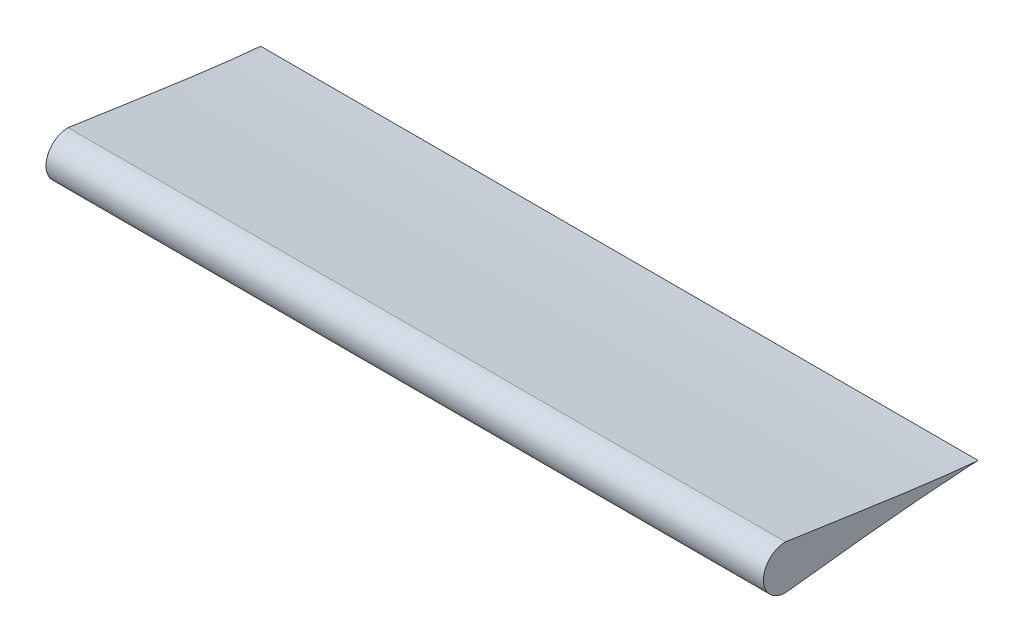
ISO-10303-21;
HEADER;
FILE_DESCRIPTION(('STEP AP214'),'2;1');
FILE_NAME('part.step','',(''),(''),'','','');
FILE_SCHEMA(('AUTOMOTIVE_DESIGN { 1 0 10303 214 1 1 1 1 }'));
ENDSEC;
DATA;
#1=APPLICATION_CONTEXT('core data for automotive mechanical design processes');
#2=APPLICATION_PROTOCOL_DEFINITION('international standard','automotive_design',2000,#1);
#3=PRODUCT_CONTEXT('',#1,'mechanical');
#4=PRODUCT('Part','Part','',(#3));
#5=PRODUCT_RELATED_PRODUCT_CATEGORY('part','',(#4));
#6=PRODUCT_DEFINITION_FORMATION('','',#4);
#7=PRODUCT_DEFINITION_CONTEXT('part definition',#1,'design');
#8=PRODUCT_DEFINITION('design','',#6,#7);
#9=PRODUCT_DEFINITION_SHAPE('','',#8);
#10=(LENGTH_UNIT() NAMED_UNIT(*) SI_UNIT(.MILLI.,.METRE.));
#11=(NAMED_UNIT(*) PLANE_ANGLE_UNIT() SI_UNIT($,.RADIAN.));
#12=(NAMED_UNIT(*) SI_UNIT($,.STERADIAN.) SOLID_ANGLE_UNIT());
#13=UNCERTAINTY_MEASURE_WITH_UNIT(LENGTH_MEASURE(1.E-05),#10,'distance_accuracy_value','');
#14=(GEOMETRIC_REPRESENTATION_CONTEXT(3) GLOBAL_UNCERTAINTY_ASSIGNED_CONTEXT((#13)) GLOBAL_UNIT_ASSIGNED_CONTEXT((#10,
#11,#12)) REPRESENTATION_CONTEXT('',''));
#15=CARTESIAN_POINT('',(0.,0.,0.));
#16=DIRECTION('',(0.,0.,1.));
#17=DIRECTION('',(1.,0.,0.));
#18=AXIS2_PLACEMENT_3D('',#15,#16,#17);
#19=CARTESIAN_POINT('',(932.,5.48492303991319,-346.600000000001));
#20=CARTESIAN_POINT('',(932.,5.49362778738663,-346.597852580919));
#21=CARTESIAN_POINT('',(932.,5.57828931731263,-345.167234249427));
#22=CARTESIAN_POINT('',(932.,5.75189803143239,-343.71043805504));
#23=CARTESIAN_POINT('',(932.,6.05499875930271,-340.208114490281));
#24=CARTESIAN_POINT('',(932.,6.49741873435106,-335.908168672115));
#25=CARTESIAN_POINT('',(932.,7.11688153715645,-330.293712937669));
#26=CARTESIAN_POINT('',(932.,7.8981787473702,-323.660621737616));
#27=CARTESIAN_POINT('',(932.,8.86731931719387,-316.003935667813));
#28=CARTESIAN_POINT('',(932.,10.0055667407348,-307.431375115838));
#29=CARTESIAN_POINT('',(932.,11.3072386025377,-298.020941908653));
#30=CARTESIAN_POINT('',(932.,12.7607482917284,-287.866437114615));
#31=CARTESIAN_POINT('',(932.,14.3419976397361,-277.062881510138));
#32=CARTESIAN_POINT('',(932.,16.0245413363357,-265.708532081932));
#33=CARTESIAN_POINT('',(932.,17.7643138135307,-253.900413677919));
#34=CARTESIAN_POINT('',(932.,19.5427898577671,-241.742132326499));
#35=CARTESIAN_POINT('',(932.,21.279803066596,-229.332900931877));
#36=CARTESIAN_POINT('',(932.,22.9571011888373,-216.768573809094));
#37=CARTESIAN_POINT('',(932.,24.400553091622,-204.080520549452));
#38=CARTESIAN_POINT('',(932.,25.5461139210719,-191.289754009893));
#39=CARTESIAN_POINT('',(932.,26.4978248972896,-178.433256045769));
#40=CARTESIAN_POINT('',(932.,27.2186317188383,-165.557442386287));
#41=CARTESIAN_POINT('',(932.,27.711658646537,-152.734886112874));
#42=CARTESIAN_POINT('',(932.,28.0019650167428,-140.032975070122));
#43=CARTESIAN_POINT('',(932.,28.0616736607792,-127.520246248135));
#44=CARTESIAN_POINT('',(932.,27.9189436259871,-115.2650849453));
#45=CARTESIAN_POINT('',(932.,27.5577560287743,-103.334541294071));
#46=CARTESIAN_POINT('',(932.,27.0006697552598,-91.7996972198163));
#47=CARTESIAN_POINT('',(932.,26.2431883229429,-80.724521293905));
#48=CARTESIAN_POINT('',(932.,25.3070472032228,-70.1756861232799));
#49=CARTESIAN_POINT('',(932.,24.182647353428,-60.2167424989174));
#50=CARTESIAN_POINT('',(932.,22.8897093843839,-50.9050900995766));
#51=CARTESIAN_POINT('',(932.,21.4097880208772,-42.2950141609851));
#52=CARTESIAN_POINT('',(932.,19.7808690039761,-34.4265564424189));
#53=CARTESIAN_POINT('',(932.,17.9593862375541,-27.334857027104));
#54=CARTESIAN_POINT('',(932.,15.9447316984175,-21.0457916868131));
#55=CARTESIAN_POINT('',(932.,13.8256713539493,-15.5468966677564));
#56=CARTESIAN_POINT('',(932.,11.5808470722572,-10.8692913452678));
#57=CARTESIAN_POINT('',(932.,9.27753496905476,-7.02450344338425));
#58=CARTESIAN_POINT('',(932.,6.94562984059433,-4.00722362393896));
#59=CARTESIAN_POINT('',(932.,4.54159528218445,-1.83797578921607));
#60=CARTESIAN_POINT('',(932.,2.20668365967197,-0.539555788466567));
#61=CARTESIAN_POINT('',(932.,0.0342194854246469,0.217479179130453));
#62=CARTESIAN_POINT('',(932.,-2.13253137856778,-0.442696975290507));
#63=CARTESIAN_POINT('',(932.,-3.57311990469622,-2.55393153359301));
#64=CARTESIAN_POINT('',(932.,-5.03014179894273,-5.40799775397902));
#65=CARTESIAN_POINT('',(932.,-6.42996468845119,-9.32218220696622));
#66=CARTESIAN_POINT('',(932.,-7.75053290484889,-14.175763480036));
#67=CARTESIAN_POINT('',(932.,-8.96721491676755,-19.9704140102435));
#68=CARTESIAN_POINT('',(932.,-10.0529189681702,-26.6659343012635));
#69=CARTESIAN_POINT('',(932.,-11.0054124337708,-34.2295339727684));
#70=CARTESIAN_POINT('',(932.,-11.8112238648561,-42.6237061592583));
#71=CARTESIAN_POINT('',(932.,-12.4666689793699,-51.8003765239409));
#72=CARTESIAN_POINT('',(932.,-12.9763735906072,-61.7097501584685));
#73=CARTESIAN_POINT('',(932.,-13.3328026263875,-72.2935771256876));
#74=CARTESIAN_POINT('',(932.,-13.5397901414656,-83.4916903814151));
#75=CARTESIAN_POINT('',(932.,-13.5960882230242,-95.2361217229905));
#76=CARTESIAN_POINT('',(932.,-13.5077074480462,-107.456450446033));
#77=CARTESIAN_POINT('',(932.,-13.2788618717373,-120.07773283464));
#78=CARTESIAN_POINT('',(932.,-12.9135498489524,-133.020320287703));
#79=CARTESIAN_POINT('',(932.,-12.4196305337505,-146.201346811317));
#80=CARTESIAN_POINT('',(932.,-11.7893297659568,-159.535041549597));
#81=CARTESIAN_POINT('',(932.,-11.0334284014507,-172.932558681055));
#82=CARTESIAN_POINT('',(932.,-10.1036923044349,-186.324187550782));
#83=CARTESIAN_POINT('',(932.,-8.97096812430148,-199.659680786966));
#84=CARTESIAN_POINT('',(932.,-7.68810078076981,-212.904448955982));
#85=CARTESIAN_POINT('',(932.,-6.29218718514479,-226.009272602402));
#86=CARTESIAN_POINT('',(932.,-4.82823959342188,-238.902789310325));
#87=CARTESIAN_POINT('',(932.,-3.36166925483122,-251.511271074392));
#88=CARTESIAN_POINT('',(932.,-1.93782108110024,-263.738942764924));
#89=CARTESIAN_POINT('',(932.,-0.613496306876071,-275.485379411777));
#90=CARTESIAN_POINT('',(932.,0.59193235798527,-286.639933501972));
#91=CARTESIAN_POINT('',(932.,1.65811298413648,-297.096452636855));
#92=CARTESIAN_POINT('',(932.,2.5719444593183,-306.755737406624));
#93=CARTESIAN_POINT('',(932.,3.33524864968809,-315.519648928747));
#94=CARTESIAN_POINT('',(932.,3.96188834155931,-323.3092405564));
#95=CARTESIAN_POINT('',(932.,4.45004267091875,-330.022501342235));
#96=CARTESIAN_POINT('',(932.,4.84379830074,-335.690543535704));
#97=CARTESIAN_POINT('',(932.,5.17604698278967,-340.042468385407));
#98=CARTESIAN_POINT('',(932.,5.38178688718854,-343.62404413471));
#99=CARTESIAN_POINT('',(932.,5.49426194639752,-345.115115042209));
#100=CARTESIAN_POINT('',(932.,5.47603395079092,-346.602192895276));
#101=CARTESIAN_POINT('',(932.,5.48492303991319,-346.600000000001));
#102=B_SPLINE_CURVE_WITH_KNOTS('',3,(#19,#20,#21,#22,#23,#24,#25,#26,#27,#28,#29,#30,#31,#32,
#33,#34,#35,#36,#37,#38,#39,#40,#41,#42,#43,#44,#45,#46,#47,#48,#49,#50,#51,#52,#53,#54,#55,#56,
#57,#58,#59,#60,#61,#62,#63,#64,#65,#66,#67,#68,#69,#70,#71,#72,#73,#74,#75,#76,#77,#78,#79,#80,
#81,#82,#83,#84,#85,#86,#87,#88,#89,#90,#91,#92,#93,#94,#95,#96,#97,#98,#99,#100,#101),
.UNSPECIFIED.,.T.,.F.,(4,1,1,1,1,1,1,1,1,1,1,1,1,1,1,1,1,1,1,1,1,1,1,1,1,1,1,1,1,1,1,1,1,1,1,1,
1,1,1,1,1,1,1,1,1,1,1,1,1,1,1,1,1,1,1,1,1,1,1,1,1,1,1,1,1,1,1,1,1,1,1,1,1,1,1,1,1,1,1,1,4),(0.,
0.000971237958935089,0.00379550488941406,0.00838889713311412,0.0147108585341679,
0.0226780451151255,0.0321935893654122,0.0431578374772158,0.0554477635765267,0.0689450810748732,
0.0835209743295518,0.0990345049396833,0.115338149300278,0.132292378261073,0.149748787287016,
0.167548160817062,0.185533000847794,0.203606824322396,0.221802152219981,0.240094780419079,
0.258381325545334,0.276593840485898,0.294615696320151,0.312363136598153,0.329758285552068,
0.34668867666744,0.363076304230722,0.378823915995178,0.393853850968574,0.408070676422894,
0.421404123740081,0.433792847882556,0.445184773052429,0.455537591190034,0.464887425285465,
0.473229998593558,0.480557633281548,0.486906623799577,0.492238034051424,0.496718364977629,
0.500526341599145,0.503606091199367,0.506177592628953,0.509478573363382,0.514052138731787,
0.519911011985978,0.527046393100711,0.535434514860353,0.545049400456516,0.555862282514593,
0.56781964692456,0.58087606000333,0.594950040868561,0.609977749598367,0.625870112949949,
0.642537246695213,0.659878939874303,0.677794441934522,0.696172799529494,0.714892973853184,
0.733838964579521,0.752890035469179,0.771908418749841,0.790874705845988,0.809754599599678,
0.828447710464764,0.846871330730811,0.864890849052298,0.882382263972322,0.89917761398861,
0.915117479075331,0.930053399369896,0.943838005379903,0.956340240690094,0.967439356026097,
0.977019226998307,0.985009700423928,0.991382470548144,0.996091139759218,0.999008193999625,1.),.UNSPECIFIED.);
#103=DIRECTION('',(-1.,0.,0.));
#104=VECTOR('',#103,1.);
#105=SURFACE_OF_LINEAR_EXTRUSION('',#102,#104);
#106=CARTESIAN_POINT('',(-470.4,-4.08102886649603,-245.320255568965));
#107=CARTESIAN_POINT('',(-470.4,-3.83688472720822,-247.42513010929));
#108=CARTESIAN_POINT('',(-470.4,-3.1162425428744,-253.618937687491));
#109=CARTESIAN_POINT('',(-470.4,-1.93782108110019,-263.738942764924));
#110=CARTESIAN_POINT('',(-470.4,-0.613496306876071,-275.485379411778));
#111=CARTESIAN_POINT('',(-470.4,0.59193235798527,-286.639933501972));
#112=CARTESIAN_POINT('',(-470.4,1.65811298413665,-297.096452636855));
#113=CARTESIAN_POINT('',(-470.4,2.57194445931841,-306.755737406624));
#114=CARTESIAN_POINT('',(-470.4,3.33524864968815,-315.519648928747));
#115=CARTESIAN_POINT('',(-470.4,3.96188834155936,-323.309240556401));
#116=CARTESIAN_POINT('',(-470.4,4.45004267091875,-330.022501342234));
#117=CARTESIAN_POINT('',(-470.4,4.84379830074011,-335.690543535704));
#118=CARTESIAN_POINT('',(-470.4,5.17604698278984,-340.042468385407));
#119=CARTESIAN_POINT('',(-470.4,5.38178688718871,-343.62404413471));
#120=CARTESIAN_POINT('',(-470.4,5.49426194639768,-345.11511504221));
#121=CARTESIAN_POINT('',(-470.4,5.47150482461145,-346.971688443804));
#122=CARTESIAN_POINT('',(-470.4,5.57828931731269,-345.167234249427));
#123=CARTESIAN_POINT('',(-470.4,5.75189803143256,-343.71043805504));
#124=CARTESIAN_POINT('',(-470.4,6.05499875930271,-340.208114490281));
#125=CARTESIAN_POINT('',(-470.4,6.49741873435111,-335.908168672115));
#126=CARTESIAN_POINT('',(-470.4,7.11688153715645,-330.29371293767));
#127=CARTESIAN_POINT('',(-470.4,7.89817874737037,-323.660621737616));
#128=CARTESIAN_POINT('',(-470.4,8.86731931719403,-316.003935667813));
#129=CARTESIAN_POINT('',(-470.4,10.0055667407348,-307.431375115838));
#130=CARTESIAN_POINT('',(-470.4,11.3072386025378,-298.020941908653));
#131=CARTESIAN_POINT('',(-470.4,12.7607482917285,-287.866437114615));
#132=CARTESIAN_POINT('',(-470.4,14.3419976397363,-277.062881510138));
#133=CARTESIAN_POINT('',(-470.4,16.0245413363361,-265.708532081931));
#134=CARTESIAN_POINT('',(-470.4,17.5608683799686,-255.281230882322));
#135=CARTESIAN_POINT('',(-470.4,18.5322005175769,-248.649148291305));
#136=CARTESIAN_POINT('',(-470.4,18.9214051721273,-245.964575178277));
#137=B_SPLINE_CURVE_WITH_KNOTS('',3,(#106,#107,#108,#109,#110,#111,#112,#113,#114,#115,#116,
#117,#118,#119,#120,#121,#122,#123,#124,#125,#126,#127,#128,#129,#130,#131,#132,#133,#134,#135,
#136),.UNSPECIFIED.,.F.,.F.,(4,1,1,1,1,1,1,1,1,1,1,1,1,1,1,1,1,1,1,1,1,1,1,1,1,1,1,1,4),(0.,
0.0312698369740128,0.092018455833629,0.150349604080833,0.205709607445592,0.257582856890572,
0.305457530292392,0.348878461716447,0.387426282479295,0.420697686369491,0.448449027633784,
0.470581998872876,0.486935458701452,0.497066543982633,0.500511139229783,0.503884300569738,
0.51369313056445,0.529646227324267,0.551602737152306,0.579273201960499,0.61232119570746,
0.650400615392583,0.693084185580216,0.73996109062668,0.79058394692021,0.844463267861992,
0.901086696087382,0.959969639400267,1.),.UNSPECIFIED.);
#138=CARTESIAN_POINT('',(-470.4,-4.08102886649603,-245.320255568965));
#139=VERTEX_POINT('',#138);
#140=CARTESIAN_POINT('',(-470.4,18.9214051721273,-245.964575178277));
#141=VERTEX_POINT('',#140);
#142=EDGE_CURVE('E91',#139,#141,#137,.T.);
#143=ORIENTED_EDGE('',*,*,#142,.T.);
#144=CARTESIAN_POINT('',(-470.4,5.48492303991321,-346.600000000001));
#145=CARTESIAN_POINT('',(-470.4,5.49362778738664,-346.597852580919));
#146=CARTESIAN_POINT('',(-470.4,5.57828931731269,-345.167234249427));
#147=CARTESIAN_POINT('',(-470.4,5.75189803143256,-343.71043805504));
#148=CARTESIAN_POINT('',(-470.4,6.05499875930271,-340.208114490281));
#149=CARTESIAN_POINT('',(-470.4,6.49741873435111,-335.908168672115));
#150=CARTESIAN_POINT('',(-470.4,7.11688153715645,-330.29371293767));
#151=CARTESIAN_POINT('',(-470.4,7.89817874737037,-323.660621737616));
#152=CARTESIAN_POINT('',(-470.4,8.86731931719403,-316.003935667813));
#153=CARTESIAN_POINT('',(-470.4,10.0055667407348,-307.431375115838));
#154=CARTESIAN_POINT('',(-470.4,11.3072386025378,-298.020941908653));
#155=CARTESIAN_POINT('',(-470.4,12.7607482917285,-287.866437114615));
#156=CARTESIAN_POINT('',(-470.4,14.3419976397363,-277.062881510138));
#157=CARTESIAN_POINT('',(-470.4,16.0245413363361,-265.708532081931));
#158=CARTESIAN_POINT('',(-470.4,17.7643138135308,-253.900413677919));
#159=CARTESIAN_POINT('',(-470.4,19.5427898577673,-241.742132326499));
#160=CARTESIAN_POINT('',(-470.4,21.279803066596,-229.332900931877));
#161=CARTESIAN_POINT('',(-470.4,22.9571011888375,-216.768573809094));
#162=CARTESIAN_POINT('',(-470.4,24.4005530916221,-204.080520549452));
#163=CARTESIAN_POINT('',(-470.4,25.546113921072,-191.289754009893));
#164=CARTESIAN_POINT('',(-470.4,26.4978248972897,-178.433256045769));
#165=CARTESIAN_POINT('',(-470.4,27.2186317188383,-165.557442386287));
#166=CARTESIAN_POINT('',(-470.4,27.711658646537,-152.734886112874));
#167=CARTESIAN_POINT('',(-470.4,28.0019650167428,-140.032975070122));
#168=CARTESIAN_POINT('',(-470.4,28.0616736607793,-127.520246248135));
#169=CARTESIAN_POINT('',(-470.4,27.9189436259871,-115.2650849453));
#170=CARTESIAN_POINT('',(-470.4,27.5577560287744,-103.334541294071));
#171=CARTESIAN_POINT('',(-470.4,27.0006697552599,-91.7996972198164));
#172=CARTESIAN_POINT('',(-470.4,26.243188322943,-80.7245212939049));
#173=CARTESIAN_POINT('',(-470.4,25.3070472032229,-70.1756861232799));
#174=CARTESIAN_POINT('',(-470.4,24.1826473534281,-60.2167424989174));
#175=CARTESIAN_POINT('',(-470.4,22.8897093843841,-50.9050900995766));
#176=CARTESIAN_POINT('',(-470.4,21.4097880208774,-42.2950141609851));
#177=CARTESIAN_POINT('',(-470.4,19.7808690039764,-34.4265564424188));
#178=CARTESIAN_POINT('',(-470.4,17.9593862375542,-27.3348570271041));
#179=CARTESIAN_POINT('',(-470.4,15.9447316984176,-21.0457916868131));
#180=CARTESIAN_POINT('',(-470.4,13.8256713539494,-15.5468966677564));
#181=CARTESIAN_POINT('',(-470.4,11.5808470722573,-10.8692913452678));
#182=CARTESIAN_POINT('',(-470.4,9.27753496905492,-7.02450344338433));
#183=CARTESIAN_POINT('',(-470.4,6.94562984059433,-4.00722362393885));
#184=CARTESIAN_POINT('',(-470.4,4.54159528218445,-1.83797578921607));
#185=CARTESIAN_POINT('',(-470.4,2.20668365967208,-0.539555788466567));
#186=CARTESIAN_POINT('',(-470.4,0.0342194854247579,0.217479179130453));
#187=CARTESIAN_POINT('',(-470.4,-2.13253137856767,-0.44269697529048));
#188=CARTESIAN_POINT('',(-470.4,-3.57311990469611,-2.55393153359304));
#189=CARTESIAN_POINT('',(-470.4,-5.03014179894257,-5.40799775397899));
#190=CARTESIAN_POINT('',(-470.4,-6.42996468845119,-9.32218220696619));
#191=CARTESIAN_POINT('',(-470.4,-7.75053290484895,-14.175763480036));
#192=CARTESIAN_POINT('',(-470.4,-8.9672149167675,-19.9704140102435));
#193=CARTESIAN_POINT('',(-470.4,-10.05291896817,-26.6659343012634));
#194=CARTESIAN_POINT('',(-470.4,-11.0054124337708,-34.2295339727684));
#195=CARTESIAN_POINT('',(-470.4,-11.8112238648559,-42.6237061592583));
#196=CARTESIAN_POINT('',(-470.4,-12.4666689793698,-51.8003765239409));
#197=CARTESIAN_POINT('',(-470.4,-12.9763735906071,-61.7097501584686));
#198=CARTESIAN_POINT('',(-470.4,-13.3328026263874,-72.2935771256876));
#199=CARTESIAN_POINT('',(-470.4,-13.5397901414656,-83.4916903814152));
#200=CARTESIAN_POINT('',(-470.4,-13.5960882230241,-95.2361217229904));
#201=CARTESIAN_POINT('',(-470.4,-13.5077074480461,-107.456450446033));
#202=CARTESIAN_POINT('',(-470.4,-13.2788618717373,-120.07773283464));
#203=CARTESIAN_POINT('',(-470.4,-12.9135498489523,-133.020320287703));
#204=CARTESIAN_POINT('',(-470.4,-12.4196305337504,-146.201346811317));
#205=CARTESIAN_POINT('',(-470.4,-11.7893297659567,-159.535041549597));
#206=CARTESIAN_POINT('',(-470.4,-11.0334284014506,-172.932558681055));
#207=CARTESIAN_POINT('',(-470.4,-10.1036923044348,-186.324187550782));
#208=CARTESIAN_POINT('',(-470.4,-8.97096812430132,-199.659680786966));
#209=CARTESIAN_POINT('',(-470.4,-7.68810078076976,-212.904448955982));
#210=CARTESIAN_POINT('',(-470.4,-6.29218718514479,-226.009272602402));
#211=CARTESIAN_POINT('',(-470.4,-4.82823959342177,-238.902789310325));
#212=CARTESIAN_POINT('',(-470.4,-3.36166925483111,-251.511271074392));
#213=CARTESIAN_POINT('',(-470.4,-1.93782108110019,-263.738942764924));
#214=CARTESIAN_POINT('',(-470.4,-0.613496306876071,-275.485379411778));
#215=CARTESIAN_POINT('',(-470.4,0.59193235798527,-286.639933501972));
#216=CARTESIAN_POINT('',(-470.4,1.65811298413665,-297.096452636855));
#217=CARTESIAN_POINT('',(-470.4,2.57194445931841,-306.755737406624));
#218=CARTESIAN_POINT('',(-470.4,3.33524864968815,-315.519648928747));
#219=CARTESIAN_POINT('',(-470.4,3.96188834155936,-323.309240556401));
#220=CARTESIAN_POINT('',(-470.4,4.45004267091875,-330.022501342234));
#221=CARTESIAN_POINT('',(-470.4,4.84379830074011,-335.690543535704));
#222=CARTESIAN_POINT('',(-470.4,5.17604698278984,-340.042468385407));
#223=CARTESIAN_POINT('',(-470.4,5.38178688718871,-343.62404413471));
#224=CARTESIAN_POINT('',(-470.4,5.49426194639768,-345.11511504221));
#225=CARTESIAN_POINT('',(-470.4,5.47603395079096,-346.602192895276));
#226=CARTESIAN_POINT('',(-470.4,5.48492303991321,-346.600000000001));
#227=B_SPLINE_CURVE_WITH_KNOTS('',3,(#144,#145,#146,#147,#148,#149,#150,#151,#152,#153,#154,
#155,#156,#157,#158,#159,#160,#161,#162,#163,#164,#165,#166,#167,#168,#169,#170,#171,#172,#173,
#174,#175,#176,#177,#178,#179,#180,#181,#182,#183,#184,#185,#186,#187,#188,#189,#190,#191,#192,
#193,#194,#195,#196,#197,#198,#199,#200,#201,#202,#203,#204,#205,#206,#207,#208,#209,#210,#211,
#212,#213,#214,#215,#216,#217,#218,#219,#220,#221,#222,#223,#224,#225,#226),.UNSPECIFIED.,.T.,
.F.,(4,1,1,1,1,1,1,1,1,1,1,1,1,1,1,1,1,1,1,1,1,1,1,1,1,1,1,1,1,1,1,1,1,1,1,1,1,1,1,1,1,1,1,1,1,
1,1,1,1,1,1,1,1,1,1,1,1,1,1,1,1,1,1,1,1,1,1,1,1,1,1,1,1,1,1,1,1,1,1,1,4),(0.,
0.000971237958935089,0.00379550488941406,0.00838889713311412,0.0147108585341679,
0.0226780451151255,0.0321935893654122,0.0431578374772158,0.0554477635765267,0.0689450810748732,
0.0835209743295518,0.0990345049396833,0.115338149300278,0.132292378261073,0.149748787287016,
0.167548160817062,0.185533000847794,0.203606824322396,0.221802152219981,0.240094780419079,
0.258381325545334,0.276593840485898,0.294615696320151,0.312363136598153,0.329758285552068,
0.34668867666744,0.363076304230722,0.378823915995178,0.393853850968574,0.408070676422894,
0.421404123740081,0.433792847882556,0.445184773052429,0.455537591190034,0.464887425285465,
0.473229998593558,0.480557633281548,0.486906623799577,0.492238034051424,0.496718364977629,
0.500526341599145,0.503606091199367,0.506177592628953,0.509478573363382,0.514052138731787,
0.519911011985978,0.527046393100711,0.535434514860353,0.545049400456516,0.555862282514593,
0.56781964692456,0.58087606000333,0.594950040868561,0.609977749598367,0.625870112949949,
0.642537246695213,0.659878939874303,0.677794441934522,0.696172799529494,0.714892973853184,
0.733838964579521,0.752890035469179,0.771908418749841,0.790874705845988,0.809754599599678,
0.828447710464764,0.846871330730811,0.864890849052298,0.882382263972322,0.89917761398861,
0.915117479075331,0.930053399369896,0.943838005379903,0.956340240690094,0.967439356026097,
0.977019226998307,0.985009700423928,0.991382470548144,0.996091139759218,0.999008193999625,1.),.UNSPECIFIED.);
#228=CARTESIAN_POINT('',(-470.4,19.4068935617341,-242.600000000001));
#229=VERTEX_POINT('',#228);
#230=EDGE_CURVE('E63',#229,#141,#227,.F.);
#231=ORIENTED_EDGE('',*,*,#230,.F.);
#232=DIRECTION('',(-1.,0.,0.));
#233=VECTOR('',#232,1.);
#234=CARTESIAN_POINT('',(-507.499999999995,19.4068935617341,-242.600000000001));
#235=LINE('',#234,#233);
#236=CARTESIAN_POINT('',(-83.,19.4068935617339,-242.600000000001));
#237=VERTEX_POINT('',#236);
#238=EDGE_CURVE('E75',#229,#237,#235,.F.);
#239=ORIENTED_EDGE('',*,*,#238,.T.);
#240=CARTESIAN_POINT('',(-83.0000000000001,5.48492303991319,-346.600000000001));
#241=CARTESIAN_POINT('',(-83.0000000000001,5.49362778738663,-346.597852580919));
#242=CARTESIAN_POINT('',(-83.0000000000001,5.57828931731263,-345.167234249427));
#243=CARTESIAN_POINT('',(-83.0000000000001,5.75189803143261,-343.71043805504));
#244=CARTESIAN_POINT('',(-83.0000000000001,6.05499875930277,-340.208114490281));
#245=CARTESIAN_POINT('',(-83.0000000000001,6.49741873435111,-335.908168672115));
#246=CARTESIAN_POINT('',(-83.0000000000001,7.11688153715651,-330.293712937669));
#247=CARTESIAN_POINT('',(-83.0000000000001,7.89817874737037,-323.660621737616));
#248=CARTESIAN_POINT('',(-83.0000000000001,8.86731931719392,-316.003935667813));
#249=CARTESIAN_POINT('',(-83.0000000000001,10.0055667407348,-307.431375115838));
#250=CARTESIAN_POINT('',(-83.0000000000001,11.3072386025378,-298.020941908653));
#251=CARTESIAN_POINT('',(-83.0000000000001,12.7607482917285,-287.866437114615));
#252=CARTESIAN_POINT('',(-83.0000000000001,14.3419976397362,-277.062881510138));
#253=CARTESIAN_POINT('',(-83.0000000000001,16.0245413363359,-265.708532081932));
#254=CARTESIAN_POINT('',(-83.,17.7643138135307,-253.900413677919));
#255=CARTESIAN_POINT('',(-83.,19.5427898577673,-241.742132326499));
#256=CARTESIAN_POINT('',(-83.,21.279803066596,-229.332900931877));
#257=CARTESIAN_POINT('',(-83.,22.9571011888375,-216.768573809094));
#258=CARTESIAN_POINT('',(-83.,24.4005530916221,-204.080520549452));
#259=CARTESIAN_POINT('',(-83.,25.546113921072,-191.289754009893));
#260=CARTESIAN_POINT('',(-83.,26.4978248972896,-178.433256045769));
#261=CARTESIAN_POINT('',(-83.,27.2186317188383,-165.557442386287));
#262=CARTESIAN_POINT('',(-83.,27.711658646537,-152.734886112874));
#263=CARTESIAN_POINT('',(-83.,28.0019650167428,-140.032975070122));
#264=CARTESIAN_POINT('',(-83.,28.0616736607793,-127.520246248135));
#265=CARTESIAN_POINT('',(-83.0000000000001,27.9189436259871,-115.2650849453));
#266=CARTESIAN_POINT('',(-83.0000000000001,27.5577560287743,-103.334541294071));
#267=CARTESIAN_POINT('',(-83.0000000000001,27.0006697552599,-91.7996972198163));
#268=CARTESIAN_POINT('',(-83.0000000000001,26.243188322943,-80.724521293905));
#269=CARTESIAN_POINT('',(-83.0000000000001,25.3070472032229,-70.1756861232799));
#270=CARTESIAN_POINT('',(-83.0000000000001,24.1826473534281,-60.2167424989174));
#271=CARTESIAN_POINT('',(-83.0000000000001,22.8897093843841,-50.9050900995766));
#272=CARTESIAN_POINT('',(-83.0000000000001,21.4097880208774,-42.2950141609851));
#273=CARTESIAN_POINT('',(-83.0000000000001,19.7808690039764,-34.4265564424188));
#274=CARTESIAN_POINT('',(-83.0000000000001,17.9593862375542,-27.334857027104));
#275=CARTESIAN_POINT('',(-83.0000000000001,15.9447316984175,-21.0457916868131));
#276=CARTESIAN_POINT('',(-83.0000000000001,13.8256713539494,-15.5468966677564));
#277=CARTESIAN_POINT('',(-83.0000000000001,11.5808470722573,-10.8692913452678));
#278=CARTESIAN_POINT('',(-83.0000000000001,9.27753496905492,-7.02450344338425));
#279=CARTESIAN_POINT('',(-83.,6.94562984059433,-4.00722362393896));
#280=CARTESIAN_POINT('',(-83.,4.54159528218451,-1.83797578921607));
#281=CARTESIAN_POINT('',(-83.,2.20668365967214,-0.539555788466567));
#282=CARTESIAN_POINT('',(-83.,0.0342194854248135,0.217479179130453));
#283=CARTESIAN_POINT('',(-83.,-2.13253137856767,-0.442696975290507));
#284=CARTESIAN_POINT('',(-83.,-3.57311990469616,-2.55393153359301));
#285=CARTESIAN_POINT('',(-83.0000000000001,-5.03014179894268,-5.40799775397902));
#286=CARTESIAN_POINT('',(-83.0000000000001,-6.42996468845114,-9.32218220696619));
#287=CARTESIAN_POINT('',(-83.0000000000001,-7.75053290484895,-14.175763480036));
#288=CARTESIAN_POINT('',(-83.0000000000001,-8.9672149167675,-19.9704140102435));
#289=CARTESIAN_POINT('',(-83.0000000000001,-10.05291896817,-26.6659343012635));
#290=CARTESIAN_POINT('',(-83.0000000000001,-11.0054124337708,-34.2295339727684));
#291=CARTESIAN_POINT('',(-83.0000000000001,-11.8112238648559,-42.6237061592583));
#292=CARTESIAN_POINT('',(-83.0000000000001,-12.4666689793699,-51.8003765239409));
#293=CARTESIAN_POINT('',(-83.0000000000001,-12.9763735906071,-61.7097501584686));
#294=CARTESIAN_POINT('',(-83.0000000000001,-13.3328026263874,-72.2935771256876));
#295=CARTESIAN_POINT('',(-83.0000000000001,-13.5397901414656,-83.4916903814151));
#296=CARTESIAN_POINT('',(-83.0000000000001,-13.5960882230241,-95.2361217229905));
#297=CARTESIAN_POINT('',(-83.0000000000001,-13.5077074480461,-107.456450446033));
#298=CARTESIAN_POINT('',(-83.0000000000001,-13.2788618717372,-120.07773283464));
#299=CARTESIAN_POINT('',(-83.,-12.9135498489523,-133.020320287703));
#300=CARTESIAN_POINT('',(-83.,-12.4196305337504,-146.201346811317));
#301=CARTESIAN_POINT('',(-83.,-11.7893297659568,-159.535041549597));
#302=CARTESIAN_POINT('',(-83.,-11.0334284014506,-172.932558681055));
#303=CARTESIAN_POINT('',(-83.,-10.1036923044348,-186.324187550782));
#304=CARTESIAN_POINT('',(-83.,-8.97096812430132,-199.659680786966));
#305=CARTESIAN_POINT('',(-83.,-7.6881007807697,-212.904448955982));
#306=CARTESIAN_POINT('',(-83.,-6.29218718514474,-226.009272602402));
#307=CARTESIAN_POINT('',(-83.,-4.82823959342182,-238.902789310325));
#308=CARTESIAN_POINT('',(-83.,-3.36166925483117,-251.511271074392));
#309=CARTESIAN_POINT('',(-83.0000000000001,-1.93782108110019,-263.738942764924));
#310=CARTESIAN_POINT('',(-83.0000000000001,-0.61349630687596,-275.485379411777));
#311=CARTESIAN_POINT('',(-83.0000000000001,0.591932357985325,-286.639933501972));
#312=CARTESIAN_POINT('',(-83.0000000000001,1.65811298413671,-297.096452636855));
#313=CARTESIAN_POINT('',(-83.0000000000001,2.57194445931846,-306.755737406624));
#314=CARTESIAN_POINT('',(-83.0000000000001,3.33524864968821,-315.519648928747));
#315=CARTESIAN_POINT('',(-83.0000000000001,3.96188834155936,-323.3092405564));
#316=CARTESIAN_POINT('',(-83.0000000000001,4.45004267091881,-330.022501342235));
#317=CARTESIAN_POINT('',(-83.0000000000001,4.84379830074016,-335.690543535704));
#318=CARTESIAN_POINT('',(-83.0000000000001,5.17604698278984,-340.042468385407));
#319=CARTESIAN_POINT('',(-83.0000000000001,5.3817868871886,-343.62404413471));
#320=CARTESIAN_POINT('',(-83.0000000000001,5.49426194639752,-345.115115042209));
#321=CARTESIAN_POINT('',(-83.0000000000001,5.47603395079092,-346.602192895276));
#322=CARTESIAN_POINT('',(-83.0000000000001,5.48492303991319,-346.600000000001));
#323=B_SPLINE_CURVE_WITH_KNOTS('',3,(#240,#241,#242,#243,#244,#245,#246,#247,#248,#249,#250,
#251,#252,#253,#254,#255,#256,#257,#258,#259,#260,#261,#262,#263,#264,#265,#266,#267,#268,#269,
#270,#271,#272,#273,#274,#275,#276,#277,#278,#279,#280,#281,#282,#283,#284,#285,#286,#287,#288,
#289,#290,#291,#292,#293,#294,#295,#296,#297,#298,#299,#300,#301,#302,#303,#304,#305,#306,#307,
#308,#309,#310,#311,#312,#313,#314,#315,#316,#317,#318,#319,#320,#321,#322),.UNSPECIFIED.,.T.,
.F.,(4,1,1,1,1,1,1,1,1,1,1,1,1,1,1,1,1,1,1,1,1,1,1,1,1,1,1,1,1,1,1,1,1,1,1,1,1,1,1,1,1,1,1,1,1,
1,1,1,1,1,1,1,1,1,1,1,1,1,1,1,1,1,1,1,1,1,1,1,1,1,1,1,1,1,1,1,1,1,1,1,4),(0.,
0.000971237958935089,0.00379550488941406,0.00838889713311412,0.0147108585341679,
0.0226780451151255,0.0321935893654122,0.0431578374772158,0.0554477635765267,0.0689450810748732,
0.0835209743295518,0.0990345049396833,0.115338149300278,0.132292378261073,0.149748787287016,
0.167548160817062,0.185533000847794,0.203606824322396,0.221802152219981,0.240094780419079,
0.258381325545334,0.276593840485898,0.294615696320151,0.312363136598153,0.329758285552068,
0.34668867666744,0.363076304230722,0.378823915995178,0.393853850968574,0.408070676422894,
0.421404123740081,0.433792847882556,0.445184773052429,0.455537591190034,0.464887425285465,
0.473229998593558,0.480557633281548,0.486906623799577,0.492238034051424,0.496718364977629,
0.500526341599145,0.503606091199367,0.506177592628953,0.509478573363382,0.514052138731787,
0.519911011985978,0.527046393100711,0.535434514860353,0.545049400456516,0.555862282514593,
0.56781964692456,0.58087606000333,0.594950040868561,0.609977749598367,0.625870112949949,
0.642537246695213,0.659878939874303,0.677794441934522,0.696172799529494,0.714892973853184,
0.733838964579521,0.752890035469179,0.771908418749841,0.790874705845988,0.809754599599678,
0.828447710464764,0.846871330730811,0.864890849052298,0.882382263972322,0.89917761398861,
0.915117479075331,0.930053399369896,0.943838005379903,0.956340240690094,0.967439356026097,
0.977019226998307,0.985009700423928,0.991382470548144,0.996091139759218,0.999008193999625,1.),.UNSPECIFIED.);
#324=CARTESIAN_POINT('',(-83.,-4.3960754774976,-242.6));
#325=VERTEX_POINT('',#324);
#326=EDGE_CURVE('E111',#237,#325,#323,.F.);
#327=ORIENTED_EDGE('',*,*,#326,.T.);
#328=DIRECTION('',(-1.,0.,0.));
#329=VECTOR('',#328,1.);
#330=CARTESIAN_POINT('',(-507.499999999995,-4.39607547749576,-242.600000000017));
#331=LINE('',#330,#329);
#332=CARTESIAN_POINT('',(-470.4,-4.39607547749765,-242.6));
#333=VERTEX_POINT('',#332);
#334=EDGE_CURVE('E70',#325,#333,#331,.T.);
#335=ORIENTED_EDGE('',*,*,#334,.T.);
#336=EDGE_CURVE('E13',#139,#333,#227,.F.);
#337=ORIENTED_EDGE('',*,*,#336,.F.);
#338=EDGE_LOOP('',(#143,#231,#239,#327,#335,#337));
#339=FACE_BOUND('',#338,.T.);
#340=ADVANCED_FACE('F52',(#339),#105,.F.);
#341=CARTESIAN_POINT('',(-82.9999999999999,-13.5960882230241,-386.283521712669));
#342=DIRECTION('',(-1.,0.,0.));
#343=DIRECTION('',(0.,0.,1.));
#344=AXIS2_PLACEMENT_3D('',#341,#342,#343);
#345=PLANE('',#344);
#346=ORIENTED_EDGE('',*,*,#326,.F.);
#347=CARTESIAN_POINT('',(-83.,7.5054090421181,-242.600000000001));
#348=DIRECTION('',(-1.,0.,0.));
#349=DIRECTION('',(0.,0.,1.));
#350=AXIS2_PLACEMENT_3D('',#347,#348,#349);
#351=CIRCLE('',#350,11.9014845196158);
#352=EDGE_CURVE('E96',#237,#325,#351,.F.);
#353=ORIENTED_EDGE('',*,*,#352,.T.);
#354=EDGE_LOOP('',(#346,#353));
#355=FACE_BOUND('',#354,.T.);
#356=ADVANCED_FACE('F127',(#355),#345,.F.);
#357=CARTESIAN_POINT('',(-470.4,5.48179990654341,-346.577317004269));
#358=DIRECTION('',(-1.,6.24224549146339E-12,7.24037287514886E-13));
#359=DIRECTION('',(-6.24224549146337E-12,-1.,0.));
#360=AXIS2_PLACEMENT_3D('',#357,#358,#359);
#361=PLANE('',#360);
#362=ORIENTED_EDGE('',*,*,#142,.F.);
#363=ORIENTED_EDGE('',*,*,#336,.T.);
#364=CARTESIAN_POINT('',(-470.4,7.5054090421181,-242.600000000001));
#365=DIRECTION('',(-1.,0.,0.));
#366=DIRECTION('',(0.,0.,1.));
#367=AXIS2_PLACEMENT_3D('',#364,#365,#366);
#368=CIRCLE('',#367,11.9014845196158);
#369=EDGE_CURVE('E93',#333,#229,#368,.T.);
#370=ORIENTED_EDGE('',*,*,#369,.T.);
#371=ORIENTED_EDGE('',*,*,#230,.T.);
#372=EDGE_LOOP('',(#362,#363,#370,#371));
#373=FACE_BOUND('',#372,.T.);
#374=ADVANCED_FACE('F90',(#373),#361,.T.);
#375=CARTESIAN_POINT('',(-470.4,7.5054090421181,-242.600000000001));
#376=DIRECTION('',(1.,0.,0.));
#377=DIRECTION('',(0.,0.,-1.));
#378=AXIS2_PLACEMENT_3D('',#375,#376,#377);
#379=CYLINDRICAL_SURFACE('',#378,11.9014845196158);
#380=ORIENTED_EDGE('',*,*,#238,.F.);
#381=ORIENTED_EDGE('',*,*,#369,.F.);
#382=ORIENTED_EDGE('',*,*,#334,.F.);
#383=ORIENTED_EDGE('',*,*,#352,.F.);
#384=EDGE_LOOP('',(#380,#381,#382,#383));
#385=FACE_BOUND('',#384,.T.);
#386=ADVANCED_FACE('F128',(#385),#379,.T.);
#387=CLOSED_SHELL('',(#340,#356,#374,#386));
#388=MANIFOLD_SOLID_BREP('B2',#387);
#389=ADVANCED_BREP_SHAPE_REPRESENTATION('',(#18,#388),#14);
#390=SHAPE_DEFINITION_REPRESENTATION(#9,#389);
ENDSEC;
END-ISO-10303-21;
